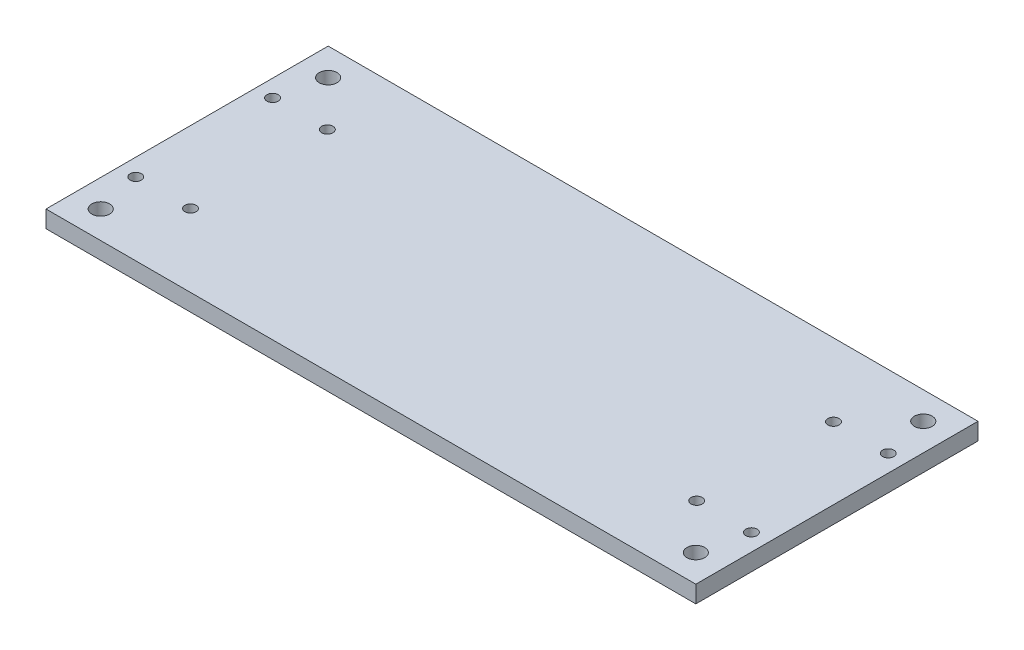
ISO-10303-21;
HEADER;
FILE_DESCRIPTION(('STEP AP214'),'2;1');
FILE_NAME('part.step','',(''),(''),'','','');
FILE_SCHEMA(('AUTOMOTIVE_DESIGN { 1 0 10303 214 1 1 1 1 }'));
ENDSEC;
DATA;
#1=APPLICATION_CONTEXT('core data for automotive mechanical design processes');
#2=APPLICATION_PROTOCOL_DEFINITION('international standard','automotive_design',2000,#1);
#3=PRODUCT_CONTEXT('',#1,'mechanical');
#4=PRODUCT('Part','Part','',(#3));
#5=PRODUCT_RELATED_PRODUCT_CATEGORY('part','',(#4));
#6=PRODUCT_DEFINITION_FORMATION('','',#4);
#7=PRODUCT_DEFINITION_CONTEXT('part definition',#1,'design');
#8=PRODUCT_DEFINITION('design','',#6,#7);
#9=PRODUCT_DEFINITION_SHAPE('','',#8);
#10=(LENGTH_UNIT() NAMED_UNIT(*) SI_UNIT(.MILLI.,.METRE.));
#11=(NAMED_UNIT(*) PLANE_ANGLE_UNIT() SI_UNIT($,.RADIAN.));
#12=(NAMED_UNIT(*) SI_UNIT($,.STERADIAN.) SOLID_ANGLE_UNIT());
#13=UNCERTAINTY_MEASURE_WITH_UNIT(LENGTH_MEASURE(1.E-05),#10,'distance_accuracy_value','');
#14=(GEOMETRIC_REPRESENTATION_CONTEXT(3) GLOBAL_UNCERTAINTY_ASSIGNED_CONTEXT((#13)) GLOBAL_UNIT_ASSIGNED_CONTEXT((#10,
#11,#12)) REPRESENTATION_CONTEXT('',''));
#15=CARTESIAN_POINT('',(0.,0.,0.));
#16=DIRECTION('',(0.,0.,1.));
#17=DIRECTION('',(1.,0.,0.));
#18=AXIS2_PLACEMENT_3D('',#15,#16,#17);
#19=CARTESIAN_POINT('',(0.,0.,0.));
#20=DIRECTION('',(0.,1.,0.));
#21=DIRECTION('',(0.,0.,1.));
#22=AXIS2_PLACEMENT_3D('',#19,#20,#21);
#23=PLANE('',#22);
#24=CARTESIAN_POINT('',(4.74999999999995,-6.59194920871187E-13,-61.25));
#25=DIRECTION('',(0.,-1.,0.));
#26=DIRECTION('',(0.,0.,-1.));
#27=AXIS2_PLACEMENT_3D('',#24,#25,#26);
#28=CIRCLE('',#27,1.64999999999999);
#29=CARTESIAN_POINT('',(4.74999999999995,-6.59194920871189E-13,-62.9));
#30=VERTEX_POINT('',#29);
#31=EDGE_CURVE('E254',#30,#30,#28,.T.);
#32=ORIENTED_EDGE('',*,*,#31,.F.);
#33=EDGE_LOOP('',(#32));
#34=FACE_BOUND('',#33,.T.);
#35=CARTESIAN_POINT('',(4.74999999999995,-6.6266436782314E-13,-21.25));
#36=DIRECTION('',(1.69642078162724E-13,-1.,0.));
#37=DIRECTION('',(0.,0.,-1.));
#38=AXIS2_PLACEMENT_3D('',#35,#36,#37);
#39=CIRCLE('',#38,1.64999999999999);
#40=CARTESIAN_POINT('',(4.74999999999995,-6.62664367823145E-13,-22.9));
#41=VERTEX_POINT('',#40);
#42=EDGE_CURVE('E257',#41,#41,#39,.T.);
#43=ORIENTED_EDGE('',*,*,#42,.F.);
#44=EDGE_LOOP('',(#43));
#45=FACE_BOUND('',#44,.T.);
#46=CARTESIAN_POINT('',(152.75,-6.50868248186498E-11,-61.25));
#47=DIRECTION('',(4.16555678839359E-13,-1.,0.));
#48=DIRECTION('',(0.,0.,-1.));
#49=AXIS2_PLACEMENT_3D('',#46,#47,#48);
#50=CIRCLE('',#49,1.64999999999999);
#51=CARTESIAN_POINT('',(152.75,-6.50868248186498E-11,-62.9));
#52=VERTEX_POINT('',#51);
#53=EDGE_CURVE('E246',#52,#52,#50,.T.);
#54=ORIENTED_EDGE('',*,*,#53,.F.);
#55=EDGE_LOOP('',(#54));
#56=FACE_BOUND('',#55,.T.);
#57=CARTESIAN_POINT('',(168.75,-8.2649165289439E-11,-61.25));
#58=DIRECTION('',(4.92050844513869E-13,-1.,0.));
#59=DIRECTION('',(0.,0.,-1.));
#60=AXIS2_PLACEMENT_3D('',#57,#58,#59);
#61=CIRCLE('',#60,1.64999999999999);
#62=CARTESIAN_POINT('',(168.75,-8.2649165289439E-11,-62.9));
#63=VERTEX_POINT('',#62);
#64=EDGE_CURVE('E242',#63,#63,#61,.T.);
#65=ORIENTED_EDGE('',*,*,#64,.F.);
#66=EDGE_LOOP('',(#65));
#67=FACE_BOUND('',#66,.T.);
#68=CARTESIAN_POINT('',(152.75,-9.17391163035575E-11,-21.25));
#69=DIRECTION('',(6.02184968556685E-13,-1.,0.));
#70=DIRECTION('',(0.,0.,-1.));
#71=AXIS2_PLACEMENT_3D('',#68,#69,#70);
#72=CIRCLE('',#71,1.64999999999999);
#73=CARTESIAN_POINT('',(152.75,-9.17391163035575E-11,-22.9));
#74=VERTEX_POINT('',#73);
#75=EDGE_CURVE('E240',#74,#74,#72,.T.);
#76=ORIENTED_EDGE('',*,*,#75,.F.);
#77=EDGE_LOOP('',(#76));
#78=FACE_BOUND('',#77,.T.);
#79=CARTESIAN_POINT('',(168.75,-1.09950243354362E-10,-21.25));
#80=DIRECTION('',(6.54587495318992E-13,-1.,0.));
#81=DIRECTION('',(0.,0.,-1.));
#82=AXIS2_PLACEMENT_3D('',#79,#80,#81);
#83=CIRCLE('',#82,1.64999999999999);
#84=CARTESIAN_POINT('',(168.75,-1.09950243354362E-10,-22.9));
#85=VERTEX_POINT('',#84);
#86=EDGE_CURVE('E243',#85,#85,#83,.T.);
#87=ORIENTED_EDGE('',*,*,#86,.F.);
#88=EDGE_LOOP('',(#87));
#89=FACE_BOUND('',#88,.T.);
#90=CARTESIAN_POINT('',(-11.2500000000001,0.,-21.25));
#91=DIRECTION('',(0.,-1.,0.));
#92=DIRECTION('',(0.,0.,-1.));
#93=AXIS2_PLACEMENT_3D('',#90,#91,#92);
#94=CIRCLE('',#93,1.64999999999999);
#95=CARTESIAN_POINT('',(-11.2500000000001,0.,-22.9));
#96=VERTEX_POINT('',#95);
#97=EDGE_CURVE('E249',#96,#96,#94,.T.);
#98=ORIENTED_EDGE('',*,*,#97,.F.);
#99=EDGE_LOOP('',(#98));
#100=FACE_BOUND('',#99,.T.);
#101=CARTESIAN_POINT('',(-11.25,4.37150315946155E-13,-61.25));
#102=DIRECTION('',(0.,-1.,0.));
#103=DIRECTION('',(0.,0.,-1.));
#104=AXIS2_PLACEMENT_3D('',#101,#102,#103);
#105=CIRCLE('',#104,1.64999999999999);
#106=CARTESIAN_POINT('',(-11.25,4.37150315946154E-13,-62.9));
#107=VERTEX_POINT('',#106);
#108=EDGE_CURVE('E107',#107,#107,#105,.T.);
#109=ORIENTED_EDGE('',*,*,#108,.F.);
#110=EDGE_LOOP('',(#109));
#111=FACE_BOUND('',#110,.T.);
#112=CARTESIAN_POINT('',(-8.25000000000004,0.,-74.5));
#113=DIRECTION('',(0.,1.,0.));
#114=DIRECTION('',(0.,0.,1.));
#115=AXIS2_PLACEMENT_3D('',#112,#113,#114);
#116=CIRCLE('',#115,2.6);
#117=CARTESIAN_POINT('',(-8.25000000000004,0.,-71.9));
#118=VERTEX_POINT('',#117);
#119=EDGE_CURVE('E146',#118,#118,#116,.T.);
#120=ORIENTED_EDGE('',*,*,#119,.T.);
#121=EDGE_LOOP('',(#120));
#122=FACE_BOUND('',#121,.T.);
#123=CARTESIAN_POINT('',(-8.25000000000004,0.,-8.00000000000002));
#124=DIRECTION('',(0.,1.,0.));
#125=DIRECTION('',(0.,0.,1.));
#126=AXIS2_PLACEMENT_3D('',#123,#124,#125);
#127=CIRCLE('',#126,2.6);
#128=CARTESIAN_POINT('',(-8.25000000000004,0.,-5.40000000000002));
#129=VERTEX_POINT('',#128);
#130=EDGE_CURVE('E130',#129,#129,#127,.F.);
#131=ORIENTED_EDGE('',*,*,#130,.F.);
#132=EDGE_LOOP('',(#131));
#133=FACE_BOUND('',#132,.T.);
#134=CARTESIAN_POINT('',(165.75,0.,-74.5));
#135=DIRECTION('',(0.,1.,0.));
#136=DIRECTION('',(0.,0.,1.));
#137=AXIS2_PLACEMENT_3D('',#134,#135,#136);
#138=CIRCLE('',#137,2.59999999999999);
#139=CARTESIAN_POINT('',(165.75,0.,-71.9));
#140=VERTEX_POINT('',#139);
#141=EDGE_CURVE('E151',#140,#140,#138,.F.);
#142=ORIENTED_EDGE('',*,*,#141,.F.);
#143=EDGE_LOOP('',(#142));
#144=FACE_BOUND('',#143,.T.);
#145=DIRECTION('',(0.,0.,1.));
#146=VECTOR('',#145,1.);
#147=CARTESIAN_POINT('',(-16.25,0.,0.));
#148=LINE('',#147,#146);
#149=CARTESIAN_POINT('',(-16.25,0.,-82.5));
#150=VERTEX_POINT('',#149);
#151=CARTESIAN_POINT('',(-16.25,0.,0.));
#152=VERTEX_POINT('',#151);
#153=EDGE_CURVE('E85',#150,#152,#148,.T.);
#154=ORIENTED_EDGE('',*,*,#153,.F.);
#155=DIRECTION('',(-1.,0.,0.));
#156=VECTOR('',#155,1.);
#157=CARTESIAN_POINT('',(173.75,0.,-82.5));
#158=LINE('',#157,#156);
#159=CARTESIAN_POINT('',(173.75,0.,-82.5));
#160=VERTEX_POINT('',#159);
#161=EDGE_CURVE('E46',#160,#150,#158,.T.);
#162=ORIENTED_EDGE('',*,*,#161,.F.);
#163=DIRECTION('',(0.,0.,-1.));
#164=VECTOR('',#163,1.);
#165=CARTESIAN_POINT('',(173.75,0.,82.5));
#166=LINE('',#165,#164);
#167=CARTESIAN_POINT('',(173.75,0.,0.));
#168=VERTEX_POINT('',#167);
#169=EDGE_CURVE('E61',#168,#160,#166,.T.);
#170=ORIENTED_EDGE('',*,*,#169,.F.);
#171=DIRECTION('',(1.,0.,0.));
#172=VECTOR('',#171,1.);
#173=CARTESIAN_POINT('',(0.,0.,0.));
#174=LINE('',#173,#172);
#175=EDGE_CURVE('E80',#152,#168,#174,.T.);
#176=ORIENTED_EDGE('',*,*,#175,.F.);
#177=EDGE_LOOP('',(#154,#162,#170,#176));
#178=FACE_BOUND('',#177,.T.);
#179=CARTESIAN_POINT('',(165.75,0.,-8.00000000000005));
#180=DIRECTION('',(0.,1.,0.));
#181=DIRECTION('',(0.,0.,1.));
#182=AXIS2_PLACEMENT_3D('',#179,#180,#181);
#183=CIRCLE('',#182,2.60000000000002);
#184=CARTESIAN_POINT('',(165.75,0.,-5.40000000000003));
#185=VERTEX_POINT('',#184);
#186=EDGE_CURVE('E139',#185,#185,#183,.T.);
#187=ORIENTED_EDGE('',*,*,#186,.T.);
#188=EDGE_LOOP('',(#187));
#189=FACE_BOUND('',#188,.T.);
#190=ADVANCED_FACE('F37',(#34,#45,#56,#67,#78,#89,#100,#111,#122,#133,#144,#178,#189),#23,.F.);
#191=CARTESIAN_POINT('',(0.,5.,0.));
#192=DIRECTION('',(0.,1.,0.));
#193=DIRECTION('',(0.,0.,1.));
#194=AXIS2_PLACEMENT_3D('',#191,#192,#193);
#195=PLANE('',#194);
#196=CARTESIAN_POINT('',(4.74999999999995,5.,-61.25));
#197=DIRECTION('',(0.,1.,0.));
#198=DIRECTION('',(0.,0.,1.));
#199=AXIS2_PLACEMENT_3D('',#196,#197,#198);
#200=CIRCLE('',#199,1.64999999999999);
#201=CARTESIAN_POINT('',(4.74999999999995,5.,-59.6));
#202=VERTEX_POINT('',#201);
#203=EDGE_CURVE('E41',#202,#202,#200,.T.);
#204=ORIENTED_EDGE('',*,*,#203,.F.);
#205=EDGE_LOOP('',(#204));
#206=FACE_BOUND('',#205,.T.);
#207=CARTESIAN_POINT('',(4.74999999999995,5.,-21.25));
#208=DIRECTION('',(0.,1.,0.));
#209=DIRECTION('',(0.,0.,1.));
#210=AXIS2_PLACEMENT_3D('',#207,#208,#209);
#211=CIRCLE('',#210,1.64999999999999);
#212=CARTESIAN_POINT('',(4.74999999999995,5.,-19.6));
#213=VERTEX_POINT('',#212);
#214=EDGE_CURVE('E121',#213,#213,#211,.T.);
#215=ORIENTED_EDGE('',*,*,#214,.F.);
#216=EDGE_LOOP('',(#215));
#217=FACE_BOUND('',#216,.T.);
#218=CARTESIAN_POINT('',(152.75,5.,-61.25));
#219=DIRECTION('',(0.,1.,0.));
#220=DIRECTION('',(0.,0.,1.));
#221=AXIS2_PLACEMENT_3D('',#218,#219,#220);
#222=CIRCLE('',#221,1.64999999999999);
#223=CARTESIAN_POINT('',(152.75,5.,-59.6));
#224=VERTEX_POINT('',#223);
#225=EDGE_CURVE('E119',#224,#224,#222,.T.);
#226=ORIENTED_EDGE('',*,*,#225,.F.);
#227=EDGE_LOOP('',(#226));
#228=FACE_BOUND('',#227,.T.);
#229=CARTESIAN_POINT('',(168.75,5.,-61.25));
#230=DIRECTION('',(0.,1.,0.));
#231=DIRECTION('',(0.,0.,1.));
#232=AXIS2_PLACEMENT_3D('',#229,#230,#231);
#233=CIRCLE('',#232,1.64999999999999);
#234=CARTESIAN_POINT('',(168.75,5.,-59.6));
#235=VERTEX_POINT('',#234);
#236=EDGE_CURVE('E116',#235,#235,#233,.T.);
#237=ORIENTED_EDGE('',*,*,#236,.F.);
#238=EDGE_LOOP('',(#237));
#239=FACE_BOUND('',#238,.T.);
#240=CARTESIAN_POINT('',(152.75,5.,-21.25));
#241=DIRECTION('',(0.,1.,0.));
#242=DIRECTION('',(0.,0.,1.));
#243=AXIS2_PLACEMENT_3D('',#240,#241,#242);
#244=CIRCLE('',#243,1.64999999999999);
#245=CARTESIAN_POINT('',(152.75,5.,-19.6));
#246=VERTEX_POINT('',#245);
#247=EDGE_CURVE('E113',#246,#246,#244,.T.);
#248=ORIENTED_EDGE('',*,*,#247,.F.);
#249=EDGE_LOOP('',(#248));
#250=FACE_BOUND('',#249,.T.);
#251=CARTESIAN_POINT('',(168.75,5.,-21.25));
#252=DIRECTION('',(0.,1.,0.));
#253=DIRECTION('',(0.,0.,1.));
#254=AXIS2_PLACEMENT_3D('',#251,#252,#253);
#255=CIRCLE('',#254,1.64999999999999);
#256=CARTESIAN_POINT('',(168.75,5.,-19.6));
#257=VERTEX_POINT('',#256);
#258=EDGE_CURVE('E110',#257,#257,#255,.T.);
#259=ORIENTED_EDGE('',*,*,#258,.F.);
#260=EDGE_LOOP('',(#259));
#261=FACE_BOUND('',#260,.T.);
#262=CARTESIAN_POINT('',(-11.2500000000001,5.,-21.25));
#263=DIRECTION('',(0.,1.,0.));
#264=DIRECTION('',(0.,0.,1.));
#265=AXIS2_PLACEMENT_3D('',#262,#263,#264);
#266=CIRCLE('',#265,1.64999999999999);
#267=CARTESIAN_POINT('',(-11.2500000000001,5.,-19.6));
#268=VERTEX_POINT('',#267);
#269=EDGE_CURVE('E106',#268,#268,#266,.T.);
#270=ORIENTED_EDGE('',*,*,#269,.F.);
#271=EDGE_LOOP('',(#270));
#272=FACE_BOUND('',#271,.T.);
#273=CARTESIAN_POINT('',(-11.25,5.,-61.25));
#274=DIRECTION('',(0.,1.,0.));
#275=DIRECTION('',(0.,0.,1.));
#276=AXIS2_PLACEMENT_3D('',#273,#274,#275);
#277=CIRCLE('',#276,1.64999999999999);
#278=CARTESIAN_POINT('',(-11.25,5.,-59.6));
#279=VERTEX_POINT('',#278);
#280=EDGE_CURVE('E103',#279,#279,#277,.T.);
#281=ORIENTED_EDGE('',*,*,#280,.F.);
#282=EDGE_LOOP('',(#281));
#283=FACE_BOUND('',#282,.T.);
#284=CARTESIAN_POINT('',(-8.25000000000004,5.,-8.00000000000002));
#285=DIRECTION('',(0.,1.,0.));
#286=DIRECTION('',(0.,0.,1.));
#287=AXIS2_PLACEMENT_3D('',#284,#285,#286);
#288=CIRCLE('',#287,2.6);
#289=CARTESIAN_POINT('',(-8.25000000000004,5.,-5.40000000000002));
#290=VERTEX_POINT('',#289);
#291=EDGE_CURVE('E126',#290,#290,#288,.F.);
#292=ORIENTED_EDGE('',*,*,#291,.T.);
#293=EDGE_LOOP('',(#292));
#294=FACE_BOUND('',#293,.T.);
#295=CARTESIAN_POINT('',(165.75,5.,-74.5));
#296=DIRECTION('',(0.,1.,0.));
#297=DIRECTION('',(0.,0.,1.));
#298=AXIS2_PLACEMENT_3D('',#295,#296,#297);
#299=CIRCLE('',#298,2.59999999999999);
#300=CARTESIAN_POINT('',(165.75,5.,-71.9));
#301=VERTEX_POINT('',#300);
#302=EDGE_CURVE('E142',#301,#301,#299,.F.);
#303=ORIENTED_EDGE('',*,*,#302,.T.);
#304=EDGE_LOOP('',(#303));
#305=FACE_BOUND('',#304,.T.);
#306=DIRECTION('',(-1.,0.,0.));
#307=VECTOR('',#306,1.);
#308=CARTESIAN_POINT('',(173.75,5.,-82.5));
#309=LINE('',#308,#307);
#310=CARTESIAN_POINT('',(173.75,5.,-82.5));
#311=VERTEX_POINT('',#310);
#312=CARTESIAN_POINT('',(-16.25,5.,-82.5));
#313=VERTEX_POINT('',#312);
#314=EDGE_CURVE('E94',#311,#313,#309,.T.);
#315=ORIENTED_EDGE('',*,*,#314,.T.);
#316=DIRECTION('',(0.,0.,1.));
#317=VECTOR('',#316,1.);
#318=CARTESIAN_POINT('',(-16.25,5.,0.));
#319=LINE('',#318,#317);
#320=CARTESIAN_POINT('',(-16.25,5.,0.));
#321=VERTEX_POINT('',#320);
#322=EDGE_CURVE('E86',#313,#321,#319,.T.);
#323=ORIENTED_EDGE('',*,*,#322,.T.);
#324=DIRECTION('',(1.,0.,0.));
#325=VECTOR('',#324,1.);
#326=CARTESIAN_POINT('',(0.,5.,0.));
#327=LINE('',#326,#325);
#328=CARTESIAN_POINT('',(173.75,5.,0.));
#329=VERTEX_POINT('',#328);
#330=EDGE_CURVE('E154',#321,#329,#327,.T.);
#331=ORIENTED_EDGE('',*,*,#330,.T.);
#332=DIRECTION('',(0.,0.,-1.));
#333=VECTOR('',#332,1.);
#334=CARTESIAN_POINT('',(173.75,5.,82.5));
#335=LINE('',#334,#333);
#336=EDGE_CURVE('E89',#329,#311,#335,.T.);
#337=ORIENTED_EDGE('',*,*,#336,.T.);
#338=EDGE_LOOP('',(#315,#323,#331,#337));
#339=FACE_BOUND('',#338,.T.);
#340=CARTESIAN_POINT('',(-8.25000000000004,5.,-74.5));
#341=DIRECTION('',(0.,1.,0.));
#342=DIRECTION('',(0.,0.,1.));
#343=AXIS2_PLACEMENT_3D('',#340,#341,#342);
#344=CIRCLE('',#343,2.6);
#345=CARTESIAN_POINT('',(-8.25000000000004,5.,-71.9));
#346=VERTEX_POINT('',#345);
#347=EDGE_CURVE('E135',#346,#346,#344,.T.);
#348=ORIENTED_EDGE('',*,*,#347,.F.);
#349=EDGE_LOOP('',(#348));
#350=FACE_BOUND('',#349,.T.);
#351=CARTESIAN_POINT('',(165.75,5.,-8.00000000000005));
#352=DIRECTION('',(0.,1.,0.));
#353=DIRECTION('',(0.,0.,1.));
#354=AXIS2_PLACEMENT_3D('',#351,#352,#353);
#355=CIRCLE('',#354,2.60000000000002);
#356=CARTESIAN_POINT('',(165.75,5.,-5.40000000000003));
#357=VERTEX_POINT('',#356);
#358=EDGE_CURVE('E143',#357,#357,#355,.T.);
#359=ORIENTED_EDGE('',*,*,#358,.F.);
#360=EDGE_LOOP('',(#359));
#361=FACE_BOUND('',#360,.T.);
#362=ADVANCED_FACE('F165',(#206,#217,#228,#239,#250,#261,#272,#283,#294,#305,#339,#350,#361),
#195,.T.);
#363=CARTESIAN_POINT('',(173.75,0.,-82.5));
#364=DIRECTION('',(0.,0.,-1.));
#365=DIRECTION('',(-1.,0.,0.));
#366=AXIS2_PLACEMENT_3D('',#363,#364,#365);
#367=PLANE('',#366);
#368=ORIENTED_EDGE('',*,*,#161,.T.);
#369=DIRECTION('',(0.,1.,0.));
#370=VECTOR('',#369,1.);
#371=CARTESIAN_POINT('',(-16.25,0.,-82.5));
#372=LINE('',#371,#370);
#373=EDGE_CURVE('E101',#150,#313,#372,.T.);
#374=ORIENTED_EDGE('',*,*,#373,.T.);
#375=ORIENTED_EDGE('',*,*,#314,.F.);
#376=DIRECTION('',(0.,1.,0.));
#377=VECTOR('',#376,1.);
#378=CARTESIAN_POINT('',(173.75,0.,-82.5));
#379=LINE('',#378,#377);
#380=EDGE_CURVE('E11',#160,#311,#379,.T.);
#381=ORIENTED_EDGE('',*,*,#380,.F.);
#382=EDGE_LOOP('',(#368,#374,#375,#381));
#383=FACE_BOUND('',#382,.T.);
#384=ADVANCED_FACE('F169',(#383),#367,.T.);
#385=CARTESIAN_POINT('',(173.75,0.,82.5));
#386=DIRECTION('',(1.,0.,0.));
#387=DIRECTION('',(0.,0.,-1.));
#388=AXIS2_PLACEMENT_3D('',#385,#386,#387);
#389=PLANE('',#388);
#390=ORIENTED_EDGE('',*,*,#336,.F.);
#391=DIRECTION('',(0.,1.,0.));
#392=VECTOR('',#391,1.);
#393=CARTESIAN_POINT('',(173.75,0.,0.));
#394=LINE('',#393,#392);
#395=EDGE_CURVE('E54',#168,#329,#394,.T.);
#396=ORIENTED_EDGE('',*,*,#395,.F.);
#397=ORIENTED_EDGE('',*,*,#169,.T.);
#398=ORIENTED_EDGE('',*,*,#380,.T.);
#399=EDGE_LOOP('',(#390,#396,#397,#398));
#400=FACE_BOUND('',#399,.T.);
#401=ADVANCED_FACE('F39',(#400),#389,.T.);
#402=CARTESIAN_POINT('',(-16.25,0.,0.));
#403=DIRECTION('',(-1.,0.,0.));
#404=DIRECTION('',(0.,0.,1.));
#405=AXIS2_PLACEMENT_3D('',#402,#403,#404);
#406=PLANE('',#405);
#407=ORIENTED_EDGE('',*,*,#322,.F.);
#408=ORIENTED_EDGE('',*,*,#373,.F.);
#409=ORIENTED_EDGE('',*,*,#153,.T.);
#410=DIRECTION('',(0.,1.,0.));
#411=VECTOR('',#410,1.);
#412=CARTESIAN_POINT('',(-16.25,0.,0.));
#413=LINE('',#412,#411);
#414=EDGE_CURVE('E82',#152,#321,#413,.T.);
#415=ORIENTED_EDGE('',*,*,#414,.T.);
#416=EDGE_LOOP('',(#407,#408,#409,#415));
#417=FACE_BOUND('',#416,.T.);
#418=ADVANCED_FACE('F163',(#417),#406,.T.);
#419=CARTESIAN_POINT('',(0.,0.,0.));
#420=DIRECTION('',(0.,0.,1.));
#421=DIRECTION('',(1.,0.,0.));
#422=AXIS2_PLACEMENT_3D('',#419,#420,#421);
#423=PLANE('',#422);
#424=ORIENTED_EDGE('',*,*,#330,.F.);
#425=ORIENTED_EDGE('',*,*,#414,.F.);
#426=ORIENTED_EDGE('',*,*,#175,.T.);
#427=ORIENTED_EDGE('',*,*,#395,.T.);
#428=EDGE_LOOP('',(#424,#425,#426,#427));
#429=FACE_BOUND('',#428,.T.);
#430=ADVANCED_FACE('F81',(#429),#423,.T.);
#431=CARTESIAN_POINT('',(165.75,0.,-74.5));
#432=DIRECTION('',(0.,1.,0.));
#433=DIRECTION('',(0.,0.,1.));
#434=AXIS2_PLACEMENT_3D('',#431,#432,#433);
#435=CYLINDRICAL_SURFACE('',#434,2.59999999999999);
#436=ORIENTED_EDGE('',*,*,#141,.T.);
#437=EDGE_LOOP('',(#436));
#438=FACE_BOUND('',#437,.T.);
#439=ORIENTED_EDGE('',*,*,#302,.F.);
#440=EDGE_LOOP('',(#439));
#441=FACE_BOUND('',#440,.T.);
#442=ADVANCED_FACE('F187',(#438,#441),#435,.F.);
#443=CARTESIAN_POINT('',(-8.25000000000004,0.,-8.00000000000002));
#444=DIRECTION('',(0.,1.,0.));
#445=DIRECTION('',(0.,0.,1.));
#446=AXIS2_PLACEMENT_3D('',#443,#444,#445);
#447=CYLINDRICAL_SURFACE('',#446,2.6);
#448=ORIENTED_EDGE('',*,*,#130,.T.);
#449=EDGE_LOOP('',(#448));
#450=FACE_BOUND('',#449,.T.);
#451=ORIENTED_EDGE('',*,*,#291,.F.);
#452=EDGE_LOOP('',(#451));
#453=FACE_BOUND('',#452,.T.);
#454=ADVANCED_FACE('F192',(#450,#453),#447,.F.);
#455=CARTESIAN_POINT('',(-8.25000000000004,0.,-74.5));
#456=DIRECTION('',(0.,1.,0.));
#457=DIRECTION('',(0.,0.,1.));
#458=AXIS2_PLACEMENT_3D('',#455,#456,#457);
#459=CYLINDRICAL_SURFACE('',#458,2.6);
#460=ORIENTED_EDGE('',*,*,#119,.F.);
#461=EDGE_LOOP('',(#460));
#462=FACE_BOUND('',#461,.T.);
#463=ORIENTED_EDGE('',*,*,#347,.T.);
#464=EDGE_LOOP('',(#463));
#465=FACE_BOUND('',#464,.T.);
#466=ADVANCED_FACE('F194',(#462,#465),#459,.F.);
#467=CARTESIAN_POINT('',(165.75,0.,-8.00000000000005));
#468=DIRECTION('',(0.,1.,0.));
#469=DIRECTION('',(0.,0.,1.));
#470=AXIS2_PLACEMENT_3D('',#467,#468,#469);
#471=CYLINDRICAL_SURFACE('',#470,2.60000000000002);
#472=ORIENTED_EDGE('',*,*,#186,.F.);
#473=EDGE_LOOP('',(#472));
#474=FACE_BOUND('',#473,.T.);
#475=ORIENTED_EDGE('',*,*,#358,.T.);
#476=EDGE_LOOP('',(#475));
#477=FACE_BOUND('',#476,.T.);
#478=ADVANCED_FACE('F197',(#474,#477),#471,.F.);
#479=CARTESIAN_POINT('',(-11.25,10.0000000000004,-61.25));
#480=DIRECTION('',(0.,-1.,0.));
#481=DIRECTION('',(0.,0.,-1.));
#482=AXIS2_PLACEMENT_3D('',#479,#480,#481);
#483=CYLINDRICAL_SURFACE('',#482,1.64999999999999);
#484=ORIENTED_EDGE('',*,*,#280,.T.);
#485=EDGE_LOOP('',(#484));
#486=FACE_BOUND('',#485,.T.);
#487=ORIENTED_EDGE('',*,*,#108,.T.);
#488=EDGE_LOOP('',(#487));
#489=FACE_BOUND('',#488,.T.);
#490=ADVANCED_FACE('F201',(#486,#489),#483,.F.);
#491=CARTESIAN_POINT('',(-11.2500000000001,10.,-21.25));
#492=DIRECTION('',(0.,-1.,0.));
#493=DIRECTION('',(0.,0.,-1.));
#494=AXIS2_PLACEMENT_3D('',#491,#492,#493);
#495=CYLINDRICAL_SURFACE('',#494,1.64999999999999);
#496=ORIENTED_EDGE('',*,*,#269,.T.);
#497=EDGE_LOOP('',(#496));
#498=FACE_BOUND('',#497,.T.);
#499=ORIENTED_EDGE('',*,*,#97,.T.);
#500=EDGE_LOOP('',(#499));
#501=FACE_BOUND('',#500,.T.);
#502=ADVANCED_FACE('F208',(#498,#501),#495,.F.);
#503=CARTESIAN_POINT('',(168.75,9.99999999989005,-21.25));
#504=DIRECTION('',(0.,-1.,0.));
#505=DIRECTION('',(0.,0.,-1.));
#506=AXIS2_PLACEMENT_3D('',#503,#504,#505);
#507=CYLINDRICAL_SURFACE('',#506,1.64999999999999);
#508=ORIENTED_EDGE('',*,*,#258,.T.);
#509=EDGE_LOOP('',(#508));
#510=FACE_BOUND('',#509,.T.);
#511=ORIENTED_EDGE('',*,*,#86,.T.);
#512=EDGE_LOOP('',(#511));
#513=FACE_BOUND('',#512,.T.);
#514=ADVANCED_FACE('F227',(#510,#513),#507,.F.);
#515=CARTESIAN_POINT('',(152.75,9.99999999990826,-21.25));
#516=DIRECTION('',(0.,-1.,0.));
#517=DIRECTION('',(0.,0.,-1.));
#518=AXIS2_PLACEMENT_3D('',#515,#516,#517);
#519=CYLINDRICAL_SURFACE('',#518,1.64999999999999);
#520=ORIENTED_EDGE('',*,*,#247,.T.);
#521=EDGE_LOOP('',(#520));
#522=FACE_BOUND('',#521,.T.);
#523=ORIENTED_EDGE('',*,*,#75,.T.);
#524=EDGE_LOOP('',(#523));
#525=FACE_BOUND('',#524,.T.);
#526=ADVANCED_FACE('F214',(#522,#525),#519,.F.);
#527=CARTESIAN_POINT('',(168.75,9.99999999991735,-61.25));
#528=DIRECTION('',(0.,-1.,0.));
#529=DIRECTION('',(0.,0.,-1.));
#530=AXIS2_PLACEMENT_3D('',#527,#528,#529);
#531=CYLINDRICAL_SURFACE('',#530,1.64999999999999);
#532=ORIENTED_EDGE('',*,*,#236,.T.);
#533=EDGE_LOOP('',(#532));
#534=FACE_BOUND('',#533,.T.);
#535=ORIENTED_EDGE('',*,*,#64,.T.);
#536=EDGE_LOOP('',(#535));
#537=FACE_BOUND('',#536,.T.);
#538=ADVANCED_FACE('F210',(#534,#537),#531,.F.);
#539=CARTESIAN_POINT('',(152.75,9.99999999993491,-61.25));
#540=DIRECTION('',(0.,-1.,0.));
#541=DIRECTION('',(0.,0.,-1.));
#542=AXIS2_PLACEMENT_3D('',#539,#540,#541);
#543=CYLINDRICAL_SURFACE('',#542,1.64999999999999);
#544=ORIENTED_EDGE('',*,*,#225,.T.);
#545=EDGE_LOOP('',(#544));
#546=FACE_BOUND('',#545,.T.);
#547=ORIENTED_EDGE('',*,*,#53,.T.);
#548=EDGE_LOOP('',(#547));
#549=FACE_BOUND('',#548,.T.);
#550=ADVANCED_FACE('F213',(#546,#549),#543,.F.);
#551=CARTESIAN_POINT('',(4.74999999999995,9.99999999999934,-21.25));
#552=DIRECTION('',(0.,-1.,0.));
#553=DIRECTION('',(0.,0.,-1.));
#554=AXIS2_PLACEMENT_3D('',#551,#552,#553);
#555=CYLINDRICAL_SURFACE('',#554,1.64999999999999);
#556=ORIENTED_EDGE('',*,*,#214,.T.);
#557=EDGE_LOOP('',(#556));
#558=FACE_BOUND('',#557,.T.);
#559=ORIENTED_EDGE('',*,*,#42,.T.);
#560=EDGE_LOOP('',(#559));
#561=FACE_BOUND('',#560,.T.);
#562=ADVANCED_FACE('F218',(#558,#561),#555,.F.);
#563=CARTESIAN_POINT('',(4.74999999999995,9.99999999999934,-61.25));
#564=DIRECTION('',(0.,-1.,0.));
#565=DIRECTION('',(0.,0.,-1.));
#566=AXIS2_PLACEMENT_3D('',#563,#564,#565);
#567=CYLINDRICAL_SURFACE('',#566,1.64999999999999);
#568=ORIENTED_EDGE('',*,*,#203,.T.);
#569=EDGE_LOOP('',(#568));
#570=FACE_BOUND('',#569,.T.);
#571=ORIENTED_EDGE('',*,*,#31,.T.);
#572=EDGE_LOOP('',(#571));
#573=FACE_BOUND('',#572,.T.);
#574=ADVANCED_FACE('F222',(#570,#573),#567,.F.);
#575=CLOSED_SHELL('',(#190,#362,#384,#401,#418,#430,#442,#454,#466,#478,#490,#502,#514,#526,
#538,#550,#562,#574));
#576=MANIFOLD_SOLID_BREP('B2',#575);
#577=ADVANCED_BREP_SHAPE_REPRESENTATION('',(#18,#576),#14);
#578=SHAPE_DEFINITION_REPRESENTATION(#9,#577);
ENDSEC;
END-ISO-10303-21;
